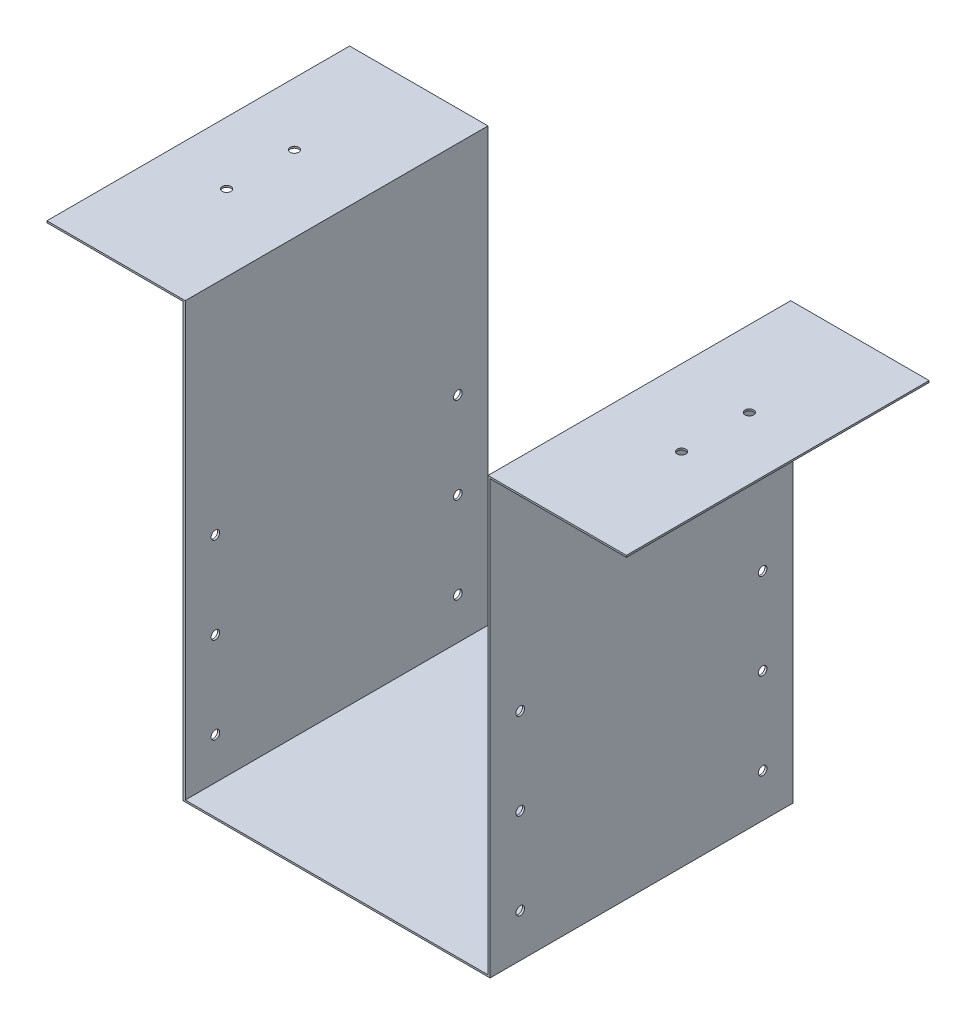
ISO-10303-21;
HEADER;
FILE_DESCRIPTION(('STEP AP214'),'2;1');
FILE_NAME('part.step','',(''),(''),'','','');
FILE_SCHEMA(('AUTOMOTIVE_DESIGN { 1 0 10303 214 1 1 1 1 }'));
ENDSEC;
DATA;
#1=APPLICATION_CONTEXT('core data for automotive mechanical design processes');
#2=APPLICATION_PROTOCOL_DEFINITION('international standard','automotive_design',2000,#1);
#3=PRODUCT_CONTEXT('',#1,'mechanical');
#4=PRODUCT('Part','Part','',(#3));
#5=PRODUCT_RELATED_PRODUCT_CATEGORY('part','',(#4));
#6=PRODUCT_DEFINITION_FORMATION('','',#4);
#7=PRODUCT_DEFINITION_CONTEXT('part definition',#1,'design');
#8=PRODUCT_DEFINITION('design','',#6,#7);
#9=PRODUCT_DEFINITION_SHAPE('','',#8);
#10=(LENGTH_UNIT() NAMED_UNIT(*) SI_UNIT(.MILLI.,.METRE.));
#11=(NAMED_UNIT(*) PLANE_ANGLE_UNIT() SI_UNIT($,.RADIAN.));
#12=(NAMED_UNIT(*) SI_UNIT($,.STERADIAN.) SOLID_ANGLE_UNIT());
#13=UNCERTAINTY_MEASURE_WITH_UNIT(LENGTH_MEASURE(1.E-05),#10,'distance_accuracy_value','');
#14=(GEOMETRIC_REPRESENTATION_CONTEXT(3) GLOBAL_UNCERTAINTY_ASSIGNED_CONTEXT((#13)) GLOBAL_UNIT_ASSIGNED_CONTEXT((#10,
#11,#12)) REPRESENTATION_CONTEXT('',''));
#15=CARTESIAN_POINT('',(0.,0.,0.));
#16=DIRECTION('',(0.,0.,1.));
#17=DIRECTION('',(1.,0.,0.));
#18=AXIS2_PLACEMENT_3D('',#15,#16,#17);
#19=CARTESIAN_POINT('',(-87.5,1.,-87.5));
#20=DIRECTION('',(0.,0.,1.));
#21=DIRECTION('',(1.,0.,0.));
#22=AXIS2_PLACEMENT_3D('',#19,#20,#21);
#23=PLANE('',#22);
#24=DIRECTION('',(-1.,0.,0.));
#25=VECTOR('',#24,1.);
#26=CARTESIAN_POINT('',(-87.5,0.,-87.5));
#27=LINE('',#26,#25);
#28=CARTESIAN_POINT('',(88.7,0.,-87.5));
#29=VERTEX_POINT('',#28);
#30=CARTESIAN_POINT('',(-88.7,0.,-87.5));
#31=VERTEX_POINT('',#30);
#32=EDGE_CURVE('E204',#29,#31,#27,.T.);
#33=ORIENTED_EDGE('',*,*,#32,.T.);
#34=DIRECTION('',(0.,-1.,0.));
#35=VECTOR('',#34,1.);
#36=CARTESIAN_POINT('',(-88.7,250.,-87.5));
#37=LINE('',#36,#35);
#38=CARTESIAN_POINT('',(-88.7,250.,-87.5));
#39=VERTEX_POINT('',#38);
#40=EDGE_CURVE('E205',#39,#31,#37,.T.);
#41=ORIENTED_EDGE('',*,*,#40,.F.);
#42=DIRECTION('',(-1.,0.,0.));
#43=VECTOR('',#42,1.);
#44=CARTESIAN_POINT('',(-87.5,250.,-87.5));
#45=LINE('',#44,#43);
#46=CARTESIAN_POINT('',(-167.5,250.,-87.5));
#47=VERTEX_POINT('',#46);
#48=EDGE_CURVE('E162',#39,#47,#45,.T.);
#49=ORIENTED_EDGE('',*,*,#48,.T.);
#50=DIRECTION('',(0.,-1.,0.));
#51=VECTOR('',#50,1.);
#52=CARTESIAN_POINT('',(-167.5,251.,-87.5));
#53=LINE('',#52,#51);
#54=CARTESIAN_POINT('',(-167.5,251.,-87.5));
#55=VERTEX_POINT('',#54);
#56=EDGE_CURVE('E181',#55,#47,#53,.T.);
#57=ORIENTED_EDGE('',*,*,#56,.F.);
#58=DIRECTION('',(-1.,0.,0.));
#59=VECTOR('',#58,1.);
#60=CARTESIAN_POINT('',(-87.5,251.,-87.5));
#61=LINE('',#60,#59);
#62=CARTESIAN_POINT('',(-87.5,251.,-87.5));
#63=VERTEX_POINT('',#62);
#64=EDGE_CURVE('E166',#63,#55,#61,.T.);
#65=ORIENTED_EDGE('',*,*,#64,.F.);
#66=DIRECTION('',(0.,-1.,0.));
#67=VECTOR('',#66,1.);
#68=CARTESIAN_POINT('',(-87.5,250.,-87.5));
#69=LINE('',#68,#67);
#70=CARTESIAN_POINT('',(-87.5,1.,-87.5));
#71=VERTEX_POINT('',#70);
#72=EDGE_CURVE('E202',#63,#71,#69,.T.);
#73=ORIENTED_EDGE('',*,*,#72,.T.);
#74=DIRECTION('',(-1.,0.,0.));
#75=VECTOR('',#74,1.);
#76=CARTESIAN_POINT('',(-87.5,1.,-87.5));
#77=LINE('',#76,#75);
#78=CARTESIAN_POINT('',(87.5,1.,-87.5));
#79=VERTEX_POINT('',#78);
#80=EDGE_CURVE('E126',#79,#71,#77,.T.);
#81=ORIENTED_EDGE('',*,*,#80,.F.);
#82=DIRECTION('',(0.,-1.,0.));
#83=VECTOR('',#82,1.);
#84=CARTESIAN_POINT('',(87.5,250.,-87.5));
#85=LINE('',#84,#83);
#86=CARTESIAN_POINT('',(87.5,251.,-87.5));
#87=VERTEX_POINT('',#86);
#88=EDGE_CURVE('E56',#87,#79,#85,.T.);
#89=ORIENTED_EDGE('',*,*,#88,.F.);
#90=DIRECTION('',(-1.,0.,0.));
#91=VECTOR('',#90,1.);
#92=CARTESIAN_POINT('',(87.5,251.,-87.5));
#93=LINE('',#92,#91);
#94=CARTESIAN_POINT('',(167.5,251.,-87.5));
#95=VERTEX_POINT('',#94);
#96=EDGE_CURVE('E123',#95,#87,#93,.T.);
#97=ORIENTED_EDGE('',*,*,#96,.F.);
#98=DIRECTION('',(0.,-1.,0.));
#99=VECTOR('',#98,1.);
#100=CARTESIAN_POINT('',(167.5,251.,-87.5));
#101=LINE('',#100,#99);
#102=CARTESIAN_POINT('',(167.5,250.,-87.5));
#103=VERTEX_POINT('',#102);
#104=EDGE_CURVE('E153',#95,#103,#101,.T.);
#105=ORIENTED_EDGE('',*,*,#104,.T.);
#106=DIRECTION('',(-1.,0.,0.));
#107=VECTOR('',#106,1.);
#108=CARTESIAN_POINT('',(87.5,250.,-87.5));
#109=LINE('',#108,#107);
#110=CARTESIAN_POINT('',(88.7,250.,-87.5));
#111=VERTEX_POINT('',#110);
#112=EDGE_CURVE('E154',#103,#111,#109,.T.);
#113=ORIENTED_EDGE('',*,*,#112,.T.);
#114=DIRECTION('',(0.,-1.,0.));
#115=VECTOR('',#114,1.);
#116=CARTESIAN_POINT('',(88.7,250.,-87.5));
#117=LINE('',#116,#115);
#118=EDGE_CURVE('E188',#111,#29,#117,.T.);
#119=ORIENTED_EDGE('',*,*,#118,.T.);
#120=EDGE_LOOP('',(#33,#41,#49,#57,#65,#73,#81,#89,#97,#105,#113,#119));
#121=FACE_BOUND('',#120,.T.);
#122=ADVANCED_FACE('F32',(#121),#23,.F.);
#123=CARTESIAN_POINT('',(-87.5,1.,87.5));
#124=DIRECTION('',(0.,0.,-1.));
#125=DIRECTION('',(-1.,0.,0.));
#126=AXIS2_PLACEMENT_3D('',#123,#124,#125);
#127=PLANE('',#126);
#128=DIRECTION('',(1.,0.,0.));
#129=VECTOR('',#128,1.);
#130=CARTESIAN_POINT('',(-87.5,0.,87.5));
#131=LINE('',#130,#129);
#132=CARTESIAN_POINT('',(-88.7,0.,87.5));
#133=VERTEX_POINT('',#132);
#134=CARTESIAN_POINT('',(88.7,0.,87.5));
#135=VERTEX_POINT('',#134);
#136=EDGE_CURVE('E214',#133,#135,#131,.T.);
#137=ORIENTED_EDGE('',*,*,#136,.T.);
#138=DIRECTION('',(0.,-1.,0.));
#139=VECTOR('',#138,1.);
#140=CARTESIAN_POINT('',(88.7,250.,87.5));
#141=LINE('',#140,#139);
#142=CARTESIAN_POINT('',(88.7,250.,87.5));
#143=VERTEX_POINT('',#142);
#144=EDGE_CURVE('E192',#143,#135,#141,.T.);
#145=ORIENTED_EDGE('',*,*,#144,.F.);
#146=DIRECTION('',(1.,0.,0.));
#147=VECTOR('',#146,1.);
#148=CARTESIAN_POINT('',(87.5,250.,87.5));
#149=LINE('',#148,#147);
#150=CARTESIAN_POINT('',(167.5,250.,87.5));
#151=VERTEX_POINT('',#150);
#152=EDGE_CURVE('E145',#143,#151,#149,.T.);
#153=ORIENTED_EDGE('',*,*,#152,.T.);
#154=DIRECTION('',(0.,-1.,0.));
#155=VECTOR('',#154,1.);
#156=CARTESIAN_POINT('',(167.5,251.,87.5));
#157=LINE('',#156,#155);
#158=CARTESIAN_POINT('',(167.5,251.,87.5));
#159=VERTEX_POINT('',#158);
#160=EDGE_CURVE('E159',#159,#151,#157,.T.);
#161=ORIENTED_EDGE('',*,*,#160,.F.);
#162=DIRECTION('',(1.,0.,0.));
#163=VECTOR('',#162,1.);
#164=CARTESIAN_POINT('',(87.5,251.,87.5));
#165=LINE('',#164,#163);
#166=CARTESIAN_POINT('',(87.5,251.,87.5));
#167=VERTEX_POINT('',#166);
#168=EDGE_CURVE('E137',#167,#159,#165,.T.);
#169=ORIENTED_EDGE('',*,*,#168,.F.);
#170=DIRECTION('',(0.,-1.,0.));
#171=VECTOR('',#170,1.);
#172=CARTESIAN_POINT('',(87.5,250.,87.5));
#173=LINE('',#172,#171);
#174=CARTESIAN_POINT('',(87.5,1.,87.5));
#175=VERTEX_POINT('',#174);
#176=EDGE_CURVE('E129',#167,#175,#173,.T.);
#177=ORIENTED_EDGE('',*,*,#176,.T.);
#178=DIRECTION('',(1.,0.,0.));
#179=VECTOR('',#178,1.);
#180=CARTESIAN_POINT('',(-87.5,1.,87.5));
#181=LINE('',#180,#179);
#182=CARTESIAN_POINT('',(-87.5,1.,87.5));
#183=VERTEX_POINT('',#182);
#184=EDGE_CURVE('E11',#183,#175,#181,.T.);
#185=ORIENTED_EDGE('',*,*,#184,.F.);
#186=DIRECTION('',(0.,-1.,0.));
#187=VECTOR('',#186,1.);
#188=CARTESIAN_POINT('',(-87.5,250.,87.5));
#189=LINE('',#188,#187);
#190=CARTESIAN_POINT('',(-87.5,251.,87.5));
#191=VERTEX_POINT('',#190);
#192=EDGE_CURVE('E48',#191,#183,#189,.T.);
#193=ORIENTED_EDGE('',*,*,#192,.F.);
#194=DIRECTION('',(1.,0.,0.));
#195=VECTOR('',#194,1.);
#196=CARTESIAN_POINT('',(-87.5,251.,87.5));
#197=LINE('',#196,#195);
#198=CARTESIAN_POINT('',(-167.5,251.,87.5));
#199=VERTEX_POINT('',#198);
#200=EDGE_CURVE('E171',#199,#191,#197,.T.);
#201=ORIENTED_EDGE('',*,*,#200,.F.);
#202=DIRECTION('',(0.,-1.,0.));
#203=VECTOR('',#202,1.);
#204=CARTESIAN_POINT('',(-167.5,251.,87.5));
#205=LINE('',#204,#203);
#206=CARTESIAN_POINT('',(-167.5,250.,87.5));
#207=VERTEX_POINT('',#206);
#208=EDGE_CURVE('E174',#199,#207,#205,.T.);
#209=ORIENTED_EDGE('',*,*,#208,.T.);
#210=DIRECTION('',(1.,0.,0.));
#211=VECTOR('',#210,1.);
#212=CARTESIAN_POINT('',(-87.5,250.,87.5));
#213=LINE('',#212,#211);
#214=CARTESIAN_POINT('',(-88.7,250.,87.5));
#215=VERTEX_POINT('',#214);
#216=EDGE_CURVE('E167',#207,#215,#213,.T.);
#217=ORIENTED_EDGE('',*,*,#216,.T.);
#218=DIRECTION('',(0.,-1.,0.));
#219=VECTOR('',#218,1.);
#220=CARTESIAN_POINT('',(-88.7,250.,87.5));
#221=LINE('',#220,#219);
#222=EDGE_CURVE('E208',#215,#133,#221,.T.);
#223=ORIENTED_EDGE('',*,*,#222,.T.);
#224=EDGE_LOOP('',(#137,#145,#153,#161,#169,#177,#185,#193,#201,#209,#217,#223));
#225=FACE_BOUND('',#224,.T.);
#226=ADVANCED_FACE('F251',(#225),#127,.F.);
#227=CARTESIAN_POINT('',(0.,1.,0.));
#228=DIRECTION('',(0.,-1.,0.));
#229=DIRECTION('',(0.,0.,-1.));
#230=AXIS2_PLACEMENT_3D('',#227,#228,#229);
#231=PLANE('',#230);
#232=DIRECTION('',(0.,0.,-1.));
#233=VECTOR('',#232,1.);
#234=CARTESIAN_POINT('',(87.5,1.,87.5));
#235=LINE('',#234,#233);
#236=EDGE_CURVE('E212',#175,#79,#235,.T.);
#237=ORIENTED_EDGE('',*,*,#236,.T.);
#238=ORIENTED_EDGE('',*,*,#80,.T.);
#239=DIRECTION('',(0.,0.,1.));
#240=VECTOR('',#239,1.);
#241=CARTESIAN_POINT('',(-87.5,1.,87.5));
#242=LINE('',#241,#240);
#243=EDGE_CURVE('E40',#71,#183,#242,.T.);
#244=ORIENTED_EDGE('',*,*,#243,.T.);
#245=ORIENTED_EDGE('',*,*,#184,.T.);
#246=EDGE_LOOP('',(#237,#238,#244,#245));
#247=FACE_BOUND('',#246,.T.);
#248=ADVANCED_FACE('F263',(#247),#231,.F.);
#249=CARTESIAN_POINT('',(0.,0.,0.));
#250=DIRECTION('',(0.,-1.,0.));
#251=DIRECTION('',(0.,0.,-1.));
#252=AXIS2_PLACEMENT_3D('',#249,#250,#251);
#253=PLANE('',#252);
#254=ORIENTED_EDGE('',*,*,#32,.F.);
#255=DIRECTION('',(0.,0.,1.));
#256=VECTOR('',#255,1.);
#257=CARTESIAN_POINT('',(88.7,0.,-87.5));
#258=LINE('',#257,#256);
#259=EDGE_CURVE('E184',#29,#135,#258,.T.);
#260=ORIENTED_EDGE('',*,*,#259,.T.);
#261=ORIENTED_EDGE('',*,*,#136,.F.);
#262=DIRECTION('',(0.,0.,-1.));
#263=VECTOR('',#262,1.);
#264=CARTESIAN_POINT('',(-88.7,0.,-87.5));
#265=LINE('',#264,#263);
#266=EDGE_CURVE('E128',#133,#31,#265,.T.);
#267=ORIENTED_EDGE('',*,*,#266,.T.);
#268=EDGE_LOOP('',(#254,#260,#261,#267));
#269=FACE_BOUND('',#268,.T.);
#270=ADVANCED_FACE('F275',(#269),#253,.T.);
#271=CARTESIAN_POINT('',(-87.5,250.,-87.5));
#272=DIRECTION('',(1.,0.,0.));
#273=DIRECTION('',(0.,0.,-1.));
#274=AXIS2_PLACEMENT_3D('',#271,#272,#273);
#275=PLANE('',#274);
#276=CARTESIAN_POINT('',(-87.5,25.,70.0773363331706));
#277=DIRECTION('',(1.,0.,0.));
#278=DIRECTION('',(0.,0.,-1.));
#279=AXIS2_PLACEMENT_3D('',#276,#277,#278);
#280=CIRCLE('',#279,2.5);
#281=CARTESIAN_POINT('',(-87.5,25.,67.5773363331706));
#282=VERTEX_POINT('',#281);
#283=EDGE_CURVE('E615',#282,#282,#280,.T.);
#284=ORIENTED_EDGE('',*,*,#283,.F.);
#285=EDGE_LOOP('',(#284));
#286=FACE_BOUND('',#285,.T.);
#287=CARTESIAN_POINT('',(-87.5,75.,70.0773363331706));
#288=DIRECTION('',(1.,0.,0.));
#289=DIRECTION('',(0.,0.,-1.));
#290=AXIS2_PLACEMENT_3D('',#287,#288,#289);
#291=CIRCLE('',#290,2.5);
#292=CARTESIAN_POINT('',(-87.5,75.,67.5773363331706));
#293=VERTEX_POINT('',#292);
#294=EDGE_CURVE('E608',#293,#293,#291,.T.);
#295=ORIENTED_EDGE('',*,*,#294,.F.);
#296=EDGE_LOOP('',(#295));
#297=FACE_BOUND('',#296,.T.);
#298=CARTESIAN_POINT('',(-87.5,125.,70.0773363331706));
#299=DIRECTION('',(1.,0.,0.));
#300=DIRECTION('',(0.,0.,-1.));
#301=AXIS2_PLACEMENT_3D('',#298,#299,#300);
#302=CIRCLE('',#301,2.5);
#303=CARTESIAN_POINT('',(-87.5,125.,67.5773363331706));
#304=VERTEX_POINT('',#303);
#305=EDGE_CURVE('E601',#304,#304,#302,.T.);
#306=ORIENTED_EDGE('',*,*,#305,.F.);
#307=EDGE_LOOP('',(#306));
#308=FACE_BOUND('',#307,.T.);
#309=CARTESIAN_POINT('',(-87.5,125.,-70.0773363331706));
#310=DIRECTION('',(1.,0.,0.));
#311=DIRECTION('',(0.,0.,-1.));
#312=AXIS2_PLACEMENT_3D('',#309,#310,#311);
#313=CIRCLE('',#312,2.5);
#314=CARTESIAN_POINT('',(-87.5,125.,-72.5773363331706));
#315=VERTEX_POINT('',#314);
#316=EDGE_CURVE('E594',#315,#315,#313,.T.);
#317=ORIENTED_EDGE('',*,*,#316,.F.);
#318=EDGE_LOOP('',(#317));
#319=FACE_BOUND('',#318,.T.);
#320=CARTESIAN_POINT('',(-87.5,75.,-70.0773363331706));
#321=DIRECTION('',(1.,0.,0.));
#322=DIRECTION('',(0.,0.,-1.));
#323=AXIS2_PLACEMENT_3D('',#320,#321,#322);
#324=CIRCLE('',#323,2.5);
#325=CARTESIAN_POINT('',(-87.5,75.,-72.5773363331706));
#326=VERTEX_POINT('',#325);
#327=EDGE_CURVE('E587',#326,#326,#324,.T.);
#328=ORIENTED_EDGE('',*,*,#327,.F.);
#329=EDGE_LOOP('',(#328));
#330=FACE_BOUND('',#329,.T.);
#331=CARTESIAN_POINT('',(-87.5,25.,-70.0773363331706));
#332=DIRECTION('',(1.,0.,0.));
#333=DIRECTION('',(0.,0.,-1.));
#334=AXIS2_PLACEMENT_3D('',#331,#332,#333);
#335=CIRCLE('',#334,2.5);
#336=CARTESIAN_POINT('',(-87.5,25.,-72.5773363331706));
#337=VERTEX_POINT('',#336);
#338=EDGE_CURVE('E573',#337,#337,#335,.T.);
#339=ORIENTED_EDGE('',*,*,#338,.F.);
#340=EDGE_LOOP('',(#339));
#341=FACE_BOUND('',#340,.T.);
#342=ORIENTED_EDGE('',*,*,#243,.F.);
#343=ORIENTED_EDGE('',*,*,#72,.F.);
#344=DIRECTION('',(0.,0.,-1.));
#345=VECTOR('',#344,1.);
#346=CARTESIAN_POINT('',(-87.5,251.,-87.5));
#347=LINE('',#346,#345);
#348=EDGE_CURVE('E163',#191,#63,#347,.T.);
#349=ORIENTED_EDGE('',*,*,#348,.F.);
#350=ORIENTED_EDGE('',*,*,#192,.T.);
#351=EDGE_LOOP('',(#342,#343,#349,#350));
#352=FACE_BOUND('',#351,.T.);
#353=ADVANCED_FACE('F260',(#286,#297,#308,#319,#330,#341,#352),#275,.T.);
#354=CARTESIAN_POINT('',(-88.7,250.,-87.5));
#355=DIRECTION('',(-1.,0.,0.));
#356=DIRECTION('',(0.,0.,1.));
#357=AXIS2_PLACEMENT_3D('',#354,#355,#356);
#358=PLANE('',#357);
#359=CARTESIAN_POINT('',(-88.7,25.,70.0773363331706));
#360=DIRECTION('',(-1.,0.,0.));
#361=DIRECTION('',(0.,0.,1.));
#362=AXIS2_PLACEMENT_3D('',#359,#360,#361);
#363=CIRCLE('',#362,2.5);
#364=CARTESIAN_POINT('',(-88.7,25.,72.5773363331706));
#365=VERTEX_POINT('',#364);
#366=EDGE_CURVE('E552',#365,#365,#363,.T.);
#367=ORIENTED_EDGE('',*,*,#366,.F.);
#368=EDGE_LOOP('',(#367));
#369=FACE_BOUND('',#368,.T.);
#370=CARTESIAN_POINT('',(-88.7,75.,70.0773363331706));
#371=DIRECTION('',(-1.,0.,0.));
#372=DIRECTION('',(0.,0.,1.));
#373=AXIS2_PLACEMENT_3D('',#370,#371,#372);
#374=CIRCLE('',#373,2.5);
#375=CARTESIAN_POINT('',(-88.7,75.,72.5773363331706));
#376=VERTEX_POINT('',#375);
#377=EDGE_CURVE('E556',#376,#376,#374,.T.);
#378=ORIENTED_EDGE('',*,*,#377,.F.);
#379=EDGE_LOOP('',(#378));
#380=FACE_BOUND('',#379,.T.);
#381=CARTESIAN_POINT('',(-88.7,125.,70.0773363331706));
#382=DIRECTION('',(-1.,0.,0.));
#383=DIRECTION('',(0.,0.,1.));
#384=AXIS2_PLACEMENT_3D('',#381,#382,#383);
#385=CIRCLE('',#384,2.5);
#386=CARTESIAN_POINT('',(-88.7,125.,72.5773363331706));
#387=VERTEX_POINT('',#386);
#388=EDGE_CURVE('E560',#387,#387,#385,.T.);
#389=ORIENTED_EDGE('',*,*,#388,.F.);
#390=EDGE_LOOP('',(#389));
#391=FACE_BOUND('',#390,.T.);
#392=CARTESIAN_POINT('',(-88.7,125.,-70.0773363331706));
#393=DIRECTION('',(-1.,0.,0.));
#394=DIRECTION('',(0.,0.,1.));
#395=AXIS2_PLACEMENT_3D('',#392,#393,#394);
#396=CIRCLE('',#395,2.5);
#397=CARTESIAN_POINT('',(-88.7,125.,-67.5773363331706));
#398=VERTEX_POINT('',#397);
#399=EDGE_CURVE('E564',#398,#398,#396,.T.);
#400=ORIENTED_EDGE('',*,*,#399,.F.);
#401=EDGE_LOOP('',(#400));
#402=FACE_BOUND('',#401,.T.);
#403=CARTESIAN_POINT('',(-88.7,75.,-70.0773363331706));
#404=DIRECTION('',(-1.,0.,0.));
#405=DIRECTION('',(0.,0.,1.));
#406=AXIS2_PLACEMENT_3D('',#403,#404,#405);
#407=CIRCLE('',#406,2.5);
#408=CARTESIAN_POINT('',(-88.7,75.,-67.5773363331706));
#409=VERTEX_POINT('',#408);
#410=EDGE_CURVE('E568',#409,#409,#407,.T.);
#411=ORIENTED_EDGE('',*,*,#410,.F.);
#412=EDGE_LOOP('',(#411));
#413=FACE_BOUND('',#412,.T.);
#414=CARTESIAN_POINT('',(-88.7,25.,-70.0773363331706));
#415=DIRECTION('',(-1.,0.,0.));
#416=DIRECTION('',(0.,0.,1.));
#417=AXIS2_PLACEMENT_3D('',#414,#415,#416);
#418=CIRCLE('',#417,2.5);
#419=CARTESIAN_POINT('',(-88.7,25.,-67.5773363331706));
#420=VERTEX_POINT('',#419);
#421=EDGE_CURVE('E571',#420,#420,#418,.T.);
#422=ORIENTED_EDGE('',*,*,#421,.F.);
#423=EDGE_LOOP('',(#422));
#424=FACE_BOUND('',#423,.T.);
#425=ORIENTED_EDGE('',*,*,#266,.F.);
#426=ORIENTED_EDGE('',*,*,#222,.F.);
#427=DIRECTION('',(0.,0.,-1.));
#428=VECTOR('',#427,1.);
#429=CARTESIAN_POINT('',(-88.7,250.,-87.5));
#430=LINE('',#429,#428);
#431=EDGE_CURVE('E197',#215,#39,#430,.T.);
#432=ORIENTED_EDGE('',*,*,#431,.T.);
#433=ORIENTED_EDGE('',*,*,#40,.T.);
#434=EDGE_LOOP('',(#425,#426,#432,#433));
#435=FACE_BOUND('',#434,.T.);
#436=ADVANCED_FACE('F249',(#369,#380,#391,#402,#413,#424,#435),#358,.T.);
#437=CARTESIAN_POINT('',(87.5,250.,-87.5));
#438=DIRECTION('',(-1.,0.,0.));
#439=DIRECTION('',(0.,0.,1.));
#440=AXIS2_PLACEMENT_3D('',#437,#438,#439);
#441=PLANE('',#440);
#442=CARTESIAN_POINT('',(87.5,25.,70.0773363331706));
#443=DIRECTION('',(-1.,0.,0.));
#444=DIRECTION('',(0.,0.,1.));
#445=AXIS2_PLACEMENT_3D('',#442,#443,#444);
#446=CIRCLE('',#445,2.5);
#447=CARTESIAN_POINT('',(87.5,25.,72.5773363331706));
#448=VERTEX_POINT('',#447);
#449=EDGE_CURVE('E611',#448,#448,#446,.T.);
#450=ORIENTED_EDGE('',*,*,#449,.F.);
#451=EDGE_LOOP('',(#450));
#452=FACE_BOUND('',#451,.T.);
#453=CARTESIAN_POINT('',(87.5,75.,70.0773363331706));
#454=DIRECTION('',(-1.,0.,0.));
#455=DIRECTION('',(0.,0.,1.));
#456=AXIS2_PLACEMENT_3D('',#453,#454,#455);
#457=CIRCLE('',#456,2.5);
#458=CARTESIAN_POINT('',(87.5,75.,72.5773363331706));
#459=VERTEX_POINT('',#458);
#460=EDGE_CURVE('E604',#459,#459,#457,.T.);
#461=ORIENTED_EDGE('',*,*,#460,.F.);
#462=EDGE_LOOP('',(#461));
#463=FACE_BOUND('',#462,.T.);
#464=CARTESIAN_POINT('',(87.5,125.,70.0773363331706));
#465=DIRECTION('',(-1.,0.,0.));
#466=DIRECTION('',(0.,0.,1.));
#467=AXIS2_PLACEMENT_3D('',#464,#465,#466);
#468=CIRCLE('',#467,2.5);
#469=CARTESIAN_POINT('',(87.5,125.,72.5773363331706));
#470=VERTEX_POINT('',#469);
#471=EDGE_CURVE('E597',#470,#470,#468,.T.);
#472=ORIENTED_EDGE('',*,*,#471,.F.);
#473=EDGE_LOOP('',(#472));
#474=FACE_BOUND('',#473,.T.);
#475=CARTESIAN_POINT('',(87.5,125.,-70.0773363331706));
#476=DIRECTION('',(-1.,0.,0.));
#477=DIRECTION('',(0.,0.,1.));
#478=AXIS2_PLACEMENT_3D('',#475,#476,#477);
#479=CIRCLE('',#478,2.5);
#480=CARTESIAN_POINT('',(87.5,125.,-67.5773363331706));
#481=VERTEX_POINT('',#480);
#482=EDGE_CURVE('E590',#481,#481,#479,.T.);
#483=ORIENTED_EDGE('',*,*,#482,.F.);
#484=EDGE_LOOP('',(#483));
#485=FACE_BOUND('',#484,.T.);
#486=CARTESIAN_POINT('',(87.5,75.,-70.0773363331706));
#487=DIRECTION('',(-1.,0.,0.));
#488=DIRECTION('',(0.,0.,1.));
#489=AXIS2_PLACEMENT_3D('',#486,#487,#488);
#490=CIRCLE('',#489,2.5);
#491=CARTESIAN_POINT('',(87.5,75.,-67.5773363331706));
#492=VERTEX_POINT('',#491);
#493=EDGE_CURVE('E577',#492,#492,#490,.T.);
#494=ORIENTED_EDGE('',*,*,#493,.F.);
#495=EDGE_LOOP('',(#494));
#496=FACE_BOUND('',#495,.T.);
#497=CARTESIAN_POINT('',(87.5,25.,-70.0773363331706));
#498=DIRECTION('',(-1.,0.,0.));
#499=DIRECTION('',(0.,0.,1.));
#500=AXIS2_PLACEMENT_3D('',#497,#498,#499);
#501=CIRCLE('',#500,2.5);
#502=CARTESIAN_POINT('',(87.5,25.,-67.5773363331706));
#503=VERTEX_POINT('',#502);
#504=EDGE_CURVE('E574',#503,#503,#501,.T.);
#505=ORIENTED_EDGE('',*,*,#504,.F.);
#506=EDGE_LOOP('',(#505));
#507=FACE_BOUND('',#506,.T.);
#508=ORIENTED_EDGE('',*,*,#236,.F.);
#509=ORIENTED_EDGE('',*,*,#176,.F.);
#510=DIRECTION('',(0.,0.,1.));
#511=VECTOR('',#510,1.);
#512=CARTESIAN_POINT('',(87.5,251.,-87.5));
#513=LINE('',#512,#511);
#514=EDGE_CURVE('E132',#87,#167,#513,.T.);
#515=ORIENTED_EDGE('',*,*,#514,.F.);
#516=ORIENTED_EDGE('',*,*,#88,.T.);
#517=EDGE_LOOP('',(#508,#509,#515,#516));
#518=FACE_BOUND('',#517,.T.);
#519=ADVANCED_FACE('F133',(#452,#463,#474,#485,#496,#507,#518),#441,.T.);
#520=CARTESIAN_POINT('',(88.7,250.,-87.5));
#521=DIRECTION('',(1.,0.,0.));
#522=DIRECTION('',(0.,0.,-1.));
#523=AXIS2_PLACEMENT_3D('',#520,#521,#522);
#524=PLANE('',#523);
#525=CARTESIAN_POINT('',(88.7,25.,70.0773363331706));
#526=DIRECTION('',(1.,0.,0.));
#527=DIRECTION('',(0.,0.,1.));
#528=AXIS2_PLACEMENT_3D('',#525,#526,#527);
#529=CIRCLE('',#528,2.5);
#530=CARTESIAN_POINT('',(88.7,25.,72.5773363331706));
#531=VERTEX_POINT('',#530);
#532=EDGE_CURVE('E670',#531,#531,#529,.T.);
#533=ORIENTED_EDGE('',*,*,#532,.F.);
#534=EDGE_LOOP('',(#533));
#535=FACE_BOUND('',#534,.T.);
#536=CARTESIAN_POINT('',(88.7,75.,70.0773363331706));
#537=DIRECTION('',(1.,0.,0.));
#538=DIRECTION('',(0.,0.,1.));
#539=AXIS2_PLACEMENT_3D('',#536,#537,#538);
#540=CIRCLE('',#539,2.5);
#541=CARTESIAN_POINT('',(88.7,75.,72.5773363331706));
#542=VERTEX_POINT('',#541);
#543=EDGE_CURVE('E673',#542,#542,#540,.T.);
#544=ORIENTED_EDGE('',*,*,#543,.F.);
#545=EDGE_LOOP('',(#544));
#546=FACE_BOUND('',#545,.T.);
#547=CARTESIAN_POINT('',(88.7,125.,70.0773363331706));
#548=DIRECTION('',(1.,0.,0.));
#549=DIRECTION('',(0.,0.,1.));
#550=AXIS2_PLACEMENT_3D('',#547,#548,#549);
#551=CIRCLE('',#550,2.5);
#552=CARTESIAN_POINT('',(88.7,125.,72.5773363331706));
#553=VERTEX_POINT('',#552);
#554=EDGE_CURVE('E676',#553,#553,#551,.T.);
#555=ORIENTED_EDGE('',*,*,#554,.F.);
#556=EDGE_LOOP('',(#555));
#557=FACE_BOUND('',#556,.T.);
#558=CARTESIAN_POINT('',(88.7,125.,-70.0773363331706));
#559=DIRECTION('',(1.,0.,0.));
#560=DIRECTION('',(0.,0.,-1.));
#561=AXIS2_PLACEMENT_3D('',#558,#559,#560);
#562=CIRCLE('',#561,2.5);
#563=CARTESIAN_POINT('',(88.7,125.,-72.5773363331706));
#564=VERTEX_POINT('',#563);
#565=EDGE_CURVE('E667',#564,#564,#562,.T.);
#566=ORIENTED_EDGE('',*,*,#565,.F.);
#567=EDGE_LOOP('',(#566));
#568=FACE_BOUND('',#567,.T.);
#569=CARTESIAN_POINT('',(88.7,75.,-70.0773363331706));
#570=DIRECTION('',(1.,0.,0.));
#571=DIRECTION('',(0.,0.,-1.));
#572=AXIS2_PLACEMENT_3D('',#569,#570,#571);
#573=CIRCLE('',#572,2.5);
#574=CARTESIAN_POINT('',(88.7,75.,-72.5773363331706));
#575=VERTEX_POINT('',#574);
#576=EDGE_CURVE('E665',#575,#575,#573,.T.);
#577=ORIENTED_EDGE('',*,*,#576,.F.);
#578=EDGE_LOOP('',(#577));
#579=FACE_BOUND('',#578,.T.);
#580=CARTESIAN_POINT('',(88.7,25.,-70.0773363331706));
#581=DIRECTION('',(1.,0.,0.));
#582=DIRECTION('',(0.,0.,-1.));
#583=AXIS2_PLACEMENT_3D('',#580,#581,#582);
#584=CIRCLE('',#583,2.5);
#585=CARTESIAN_POINT('',(88.7,25.,-72.5773363331706));
#586=VERTEX_POINT('',#585);
#587=EDGE_CURVE('E580',#586,#586,#584,.T.);
#588=ORIENTED_EDGE('',*,*,#587,.F.);
#589=EDGE_LOOP('',(#588));
#590=FACE_BOUND('',#589,.T.);
#591=ORIENTED_EDGE('',*,*,#259,.F.);
#592=ORIENTED_EDGE('',*,*,#118,.F.);
#593=DIRECTION('',(0.,0.,1.));
#594=VECTOR('',#593,1.);
#595=CARTESIAN_POINT('',(88.7,250.,-87.5));
#596=LINE('',#595,#594);
#597=EDGE_CURVE('E185',#111,#143,#596,.T.);
#598=ORIENTED_EDGE('',*,*,#597,.T.);
#599=ORIENTED_EDGE('',*,*,#144,.T.);
#600=EDGE_LOOP('',(#591,#592,#598,#599));
#601=FACE_BOUND('',#600,.T.);
#602=ADVANCED_FACE('F273',(#535,#546,#557,#568,#579,#590,#601),#524,.T.);
#603=CARTESIAN_POINT('',(-167.5,251.,-87.5));
#604=DIRECTION('',(1.,0.,0.));
#605=DIRECTION('',(0.,0.,-1.));
#606=AXIS2_PLACEMENT_3D('',#603,#604,#605);
#607=PLANE('',#606);
#608=DIRECTION('',(0.,0.,1.));
#609=VECTOR('',#608,1.);
#610=CARTESIAN_POINT('',(-167.5,250.,-87.5));
#611=LINE('',#610,#609);
#612=EDGE_CURVE('E176',#47,#207,#611,.T.);
#613=ORIENTED_EDGE('',*,*,#612,.T.);
#614=ORIENTED_EDGE('',*,*,#208,.F.);
#615=DIRECTION('',(0.,0.,1.));
#616=VECTOR('',#615,1.);
#617=CARTESIAN_POINT('',(-167.5,251.,-87.5));
#618=LINE('',#617,#616);
#619=EDGE_CURVE('E169',#55,#199,#618,.T.);
#620=ORIENTED_EDGE('',*,*,#619,.F.);
#621=ORIENTED_EDGE('',*,*,#56,.T.);
#622=EDGE_LOOP('',(#613,#614,#620,#621));
#623=FACE_BOUND('',#622,.T.);
#624=ADVANCED_FACE('F257',(#623),#607,.F.);
#625=CARTESIAN_POINT('',(0.,251.,0.));
#626=DIRECTION('',(0.,-1.,0.));
#627=DIRECTION('',(0.,0.,-1.));
#628=AXIS2_PLACEMENT_3D('',#625,#626,#627);
#629=PLANE('',#628);
#630=CARTESIAN_POINT('',(-131.5,251.,-19.6));
#631=DIRECTION('',(0.,1.,0.));
#632=DIRECTION('',(0.,0.,-1.));
#633=AXIS2_PLACEMENT_3D('',#630,#631,#632);
#634=CIRCLE('',#633,2.50000000000005);
#635=CARTESIAN_POINT('',(-131.5,251.,-22.1000000000001));
#636=VERTEX_POINT('',#635);
#637=EDGE_CURVE('E617',#636,#636,#634,.T.);
#638=ORIENTED_EDGE('',*,*,#637,.F.);
#639=EDGE_LOOP('',(#638));
#640=FACE_BOUND('',#639,.T.);
#641=CARTESIAN_POINT('',(-131.5,251.,19.6));
#642=DIRECTION('',(0.,1.,0.));
#643=DIRECTION('',(0.,0.,1.));
#644=AXIS2_PLACEMENT_3D('',#641,#642,#643);
#645=CIRCLE('',#644,2.50000000000005);
#646=CARTESIAN_POINT('',(-131.5,251.,22.1000000000001));
#647=VERTEX_POINT('',#646);
#648=EDGE_CURVE('E621',#647,#647,#645,.T.);
#649=ORIENTED_EDGE('',*,*,#648,.F.);
#650=EDGE_LOOP('',(#649));
#651=FACE_BOUND('',#650,.T.);
#652=ORIENTED_EDGE('',*,*,#348,.T.);
#653=ORIENTED_EDGE('',*,*,#64,.T.);
#654=ORIENTED_EDGE('',*,*,#619,.T.);
#655=ORIENTED_EDGE('',*,*,#200,.T.);
#656=EDGE_LOOP('',(#652,#653,#654,#655));
#657=FACE_BOUND('',#656,.T.);
#658=ADVANCED_FACE('F238',(#640,#651,#657),#629,.F.);
#659=CARTESIAN_POINT('',(0.,250.,0.));
#660=DIRECTION('',(0.,-1.,0.));
#661=DIRECTION('',(0.,0.,-1.));
#662=AXIS2_PLACEMENT_3D('',#659,#660,#661);
#663=PLANE('',#662);
#664=CARTESIAN_POINT('',(-131.5,250.,-19.6));
#665=DIRECTION('',(0.,-1.,0.));
#666=DIRECTION('',(0.,0.,-1.));
#667=AXIS2_PLACEMENT_3D('',#664,#665,#666);
#668=CIRCLE('',#667,2.50000000000005);
#669=CARTESIAN_POINT('',(-131.5,250.,-22.1000000000001));
#670=VERTEX_POINT('',#669);
#671=EDGE_CURVE('E35',#670,#670,#668,.T.);
#672=ORIENTED_EDGE('',*,*,#671,.F.);
#673=EDGE_LOOP('',(#672));
#674=FACE_BOUND('',#673,.T.);
#675=CARTESIAN_POINT('',(-131.5,250.,19.6));
#676=DIRECTION('',(0.,-1.,0.));
#677=DIRECTION('',(0.,0.,-1.));
#678=AXIS2_PLACEMENT_3D('',#675,#676,#677);
#679=CIRCLE('',#678,2.50000000000005);
#680=CARTESIAN_POINT('',(-131.5,250.,17.1));
#681=VERTEX_POINT('',#680);
#682=EDGE_CURVE('E224',#681,#681,#679,.T.);
#683=ORIENTED_EDGE('',*,*,#682,.F.);
#684=EDGE_LOOP('',(#683));
#685=FACE_BOUND('',#684,.T.);
#686=ORIENTED_EDGE('',*,*,#48,.F.);
#687=ORIENTED_EDGE('',*,*,#431,.F.);
#688=ORIENTED_EDGE('',*,*,#216,.F.);
#689=ORIENTED_EDGE('',*,*,#612,.F.);
#690=EDGE_LOOP('',(#686,#687,#688,#689));
#691=FACE_BOUND('',#690,.T.);
#692=ADVANCED_FACE('F234',(#674,#685,#691),#663,.T.);
#693=CARTESIAN_POINT('',(167.5,251.,-87.5));
#694=DIRECTION('',(-1.,0.,0.));
#695=DIRECTION('',(0.,0.,1.));
#696=AXIS2_PLACEMENT_3D('',#693,#694,#695);
#697=PLANE('',#696);
#698=DIRECTION('',(0.,0.,-1.));
#699=VECTOR('',#698,1.);
#700=CARTESIAN_POINT('',(167.5,250.,-87.5));
#701=LINE('',#700,#699);
#702=EDGE_CURVE('E143',#151,#103,#701,.T.);
#703=ORIENTED_EDGE('',*,*,#702,.T.);
#704=ORIENTED_EDGE('',*,*,#104,.F.);
#705=DIRECTION('',(0.,0.,-1.));
#706=VECTOR('',#705,1.);
#707=CARTESIAN_POINT('',(167.5,251.,-87.5));
#708=LINE('',#707,#706);
#709=EDGE_CURVE('E141',#159,#95,#708,.T.);
#710=ORIENTED_EDGE('',*,*,#709,.F.);
#711=ORIENTED_EDGE('',*,*,#160,.T.);
#712=EDGE_LOOP('',(#703,#704,#710,#711));
#713=FACE_BOUND('',#712,.T.);
#714=ADVANCED_FACE('F237',(#713),#697,.F.);
#715=CARTESIAN_POINT('',(0.,251.,0.));
#716=DIRECTION('',(0.,-1.,0.));
#717=DIRECTION('',(0.,0.,-1.));
#718=AXIS2_PLACEMENT_3D('',#715,#716,#717);
#719=PLANE('',#718);
#720=CARTESIAN_POINT('',(131.5,251.,19.6));
#721=DIRECTION('',(0.,1.,0.));
#722=DIRECTION('',(0.,0.,-1.));
#723=AXIS2_PLACEMENT_3D('',#720,#721,#722);
#724=CIRCLE('',#723,2.5);
#725=CARTESIAN_POINT('',(131.5,251.,17.1));
#726=VERTEX_POINT('',#725);
#727=EDGE_CURVE('E618',#726,#726,#724,.T.);
#728=ORIENTED_EDGE('',*,*,#727,.F.);
#729=EDGE_LOOP('',(#728));
#730=FACE_BOUND('',#729,.T.);
#731=CARTESIAN_POINT('',(131.5,251.,-19.6));
#732=DIRECTION('',(0.,1.,0.));
#733=DIRECTION('',(0.,0.,1.));
#734=AXIS2_PLACEMENT_3D('',#731,#732,#733);
#735=CIRCLE('',#734,2.5);
#736=CARTESIAN_POINT('',(131.5,251.,-17.1));
#737=VERTEX_POINT('',#736);
#738=EDGE_CURVE('E148',#737,#737,#735,.T.);
#739=ORIENTED_EDGE('',*,*,#738,.F.);
#740=EDGE_LOOP('',(#739));
#741=FACE_BOUND('',#740,.T.);
#742=ORIENTED_EDGE('',*,*,#96,.T.);
#743=ORIENTED_EDGE('',*,*,#514,.T.);
#744=ORIENTED_EDGE('',*,*,#168,.T.);
#745=ORIENTED_EDGE('',*,*,#709,.T.);
#746=EDGE_LOOP('',(#742,#743,#744,#745));
#747=FACE_BOUND('',#746,.T.);
#748=ADVANCED_FACE('F139',(#730,#741,#747),#719,.F.);
#749=CARTESIAN_POINT('',(0.,250.,0.));
#750=DIRECTION('',(0.,-1.,0.));
#751=DIRECTION('',(0.,0.,-1.));
#752=AXIS2_PLACEMENT_3D('',#749,#750,#751);
#753=PLANE('',#752);
#754=CARTESIAN_POINT('',(131.5,250.,19.6));
#755=DIRECTION('',(0.,-1.,0.));
#756=DIRECTION('',(0.,0.,-1.));
#757=AXIS2_PLACEMENT_3D('',#754,#755,#756);
#758=CIRCLE('',#757,2.5);
#759=CARTESIAN_POINT('',(131.5,250.,17.1));
#760=VERTEX_POINT('',#759);
#761=EDGE_CURVE('E222',#760,#760,#758,.T.);
#762=ORIENTED_EDGE('',*,*,#761,.F.);
#763=EDGE_LOOP('',(#762));
#764=FACE_BOUND('',#763,.T.);
#765=CARTESIAN_POINT('',(131.5,250.,-19.6));
#766=DIRECTION('',(0.,-1.,0.));
#767=DIRECTION('',(0.,0.,-1.));
#768=AXIS2_PLACEMENT_3D('',#765,#766,#767);
#769=CIRCLE('',#768,2.5);
#770=CARTESIAN_POINT('',(131.5,250.,-22.1));
#771=VERTEX_POINT('',#770);
#772=EDGE_CURVE('E219',#771,#771,#769,.T.);
#773=ORIENTED_EDGE('',*,*,#772,.F.);
#774=EDGE_LOOP('',(#773));
#775=FACE_BOUND('',#774,.T.);
#776=ORIENTED_EDGE('',*,*,#152,.F.);
#777=ORIENTED_EDGE('',*,*,#597,.F.);
#778=ORIENTED_EDGE('',*,*,#112,.F.);
#779=ORIENTED_EDGE('',*,*,#702,.F.);
#780=EDGE_LOOP('',(#776,#777,#778,#779));
#781=FACE_BOUND('',#780,.T.);
#782=ADVANCED_FACE('F270',(#764,#775,#781),#753,.T.);
#783=CARTESIAN_POINT('',(131.5,241.,-19.6));
#784=DIRECTION('',(0.,1.,0.));
#785=DIRECTION('',(0.,0.,1.));
#786=AXIS2_PLACEMENT_3D('',#783,#784,#785);
#787=CYLINDRICAL_SURFACE('',#786,2.5);
#788=ORIENTED_EDGE('',*,*,#772,.T.);
#789=EDGE_LOOP('',(#788));
#790=FACE_BOUND('',#789,.T.);
#791=ORIENTED_EDGE('',*,*,#738,.T.);
#792=EDGE_LOOP('',(#791));
#793=FACE_BOUND('',#792,.T.);
#794=ADVANCED_FACE('F387',(#790,#793),#787,.F.);
#795=CARTESIAN_POINT('',(131.5,241.,19.6));
#796=DIRECTION('',(0.,1.,0.));
#797=DIRECTION('',(0.,0.,1.));
#798=AXIS2_PLACEMENT_3D('',#795,#796,#797);
#799=CYLINDRICAL_SURFACE('',#798,2.5);
#800=ORIENTED_EDGE('',*,*,#761,.T.);
#801=EDGE_LOOP('',(#800));
#802=FACE_BOUND('',#801,.T.);
#803=ORIENTED_EDGE('',*,*,#727,.T.);
#804=EDGE_LOOP('',(#803));
#805=FACE_BOUND('',#804,.T.);
#806=ADVANCED_FACE('F396',(#802,#805),#799,.F.);
#807=CARTESIAN_POINT('',(-131.5,241.,19.6));
#808=DIRECTION('',(0.,1.,0.));
#809=DIRECTION('',(0.,0.,1.));
#810=AXIS2_PLACEMENT_3D('',#807,#808,#809);
#811=CYLINDRICAL_SURFACE('',#810,2.50000000000005);
#812=ORIENTED_EDGE('',*,*,#682,.T.);
#813=EDGE_LOOP('',(#812));
#814=FACE_BOUND('',#813,.T.);
#815=ORIENTED_EDGE('',*,*,#648,.T.);
#816=EDGE_LOOP('',(#815));
#817=FACE_BOUND('',#816,.T.);
#818=ADVANCED_FACE('F405',(#814,#817),#811,.F.);
#819=CARTESIAN_POINT('',(-131.5,241.,-19.6));
#820=DIRECTION('',(0.,1.,0.));
#821=DIRECTION('',(0.,0.,1.));
#822=AXIS2_PLACEMENT_3D('',#819,#820,#821);
#823=CYLINDRICAL_SURFACE('',#822,2.50000000000005);
#824=ORIENTED_EDGE('',*,*,#671,.T.);
#825=EDGE_LOOP('',(#824));
#826=FACE_BOUND('',#825,.T.);
#827=ORIENTED_EDGE('',*,*,#637,.T.);
#828=EDGE_LOOP('',(#827));
#829=FACE_BOUND('',#828,.T.);
#830=ADVANCED_FACE('F231',(#826,#829),#823,.F.);
#831=CARTESIAN_POINT('',(-211.3,25.,-70.0773363331706));
#832=DIRECTION('',(1.,0.,0.));
#833=DIRECTION('',(0.,0.,-1.));
#834=AXIS2_PLACEMENT_3D('',#831,#832,#833);
#835=CYLINDRICAL_SURFACE('',#834,2.5);
#836=ORIENTED_EDGE('',*,*,#504,.T.);
#837=EDGE_LOOP('',(#836));
#838=FACE_BOUND('',#837,.T.);
#839=ORIENTED_EDGE('',*,*,#587,.T.);
#840=EDGE_LOOP('',(#839));
#841=FACE_BOUND('',#840,.T.);
#842=ADVANCED_FACE('F421',(#838,#841),#835,.F.);
#843=CARTESIAN_POINT('',(-211.3,75.,-70.0773363331706));
#844=DIRECTION('',(1.,0.,0.));
#845=DIRECTION('',(0.,0.,-1.));
#846=AXIS2_PLACEMENT_3D('',#843,#844,#845);
#847=CYLINDRICAL_SURFACE('',#846,2.5);
#848=ORIENTED_EDGE('',*,*,#493,.T.);
#849=EDGE_LOOP('',(#848));
#850=FACE_BOUND('',#849,.T.);
#851=ORIENTED_EDGE('',*,*,#576,.T.);
#852=EDGE_LOOP('',(#851));
#853=FACE_BOUND('',#852,.T.);
#854=ADVANCED_FACE('F429',(#850,#853),#847,.F.);
#855=CARTESIAN_POINT('',(-211.3,125.,-70.0773363331706));
#856=DIRECTION('',(1.,0.,0.));
#857=DIRECTION('',(0.,0.,-1.));
#858=AXIS2_PLACEMENT_3D('',#855,#856,#857);
#859=CYLINDRICAL_SURFACE('',#858,2.5);
#860=ORIENTED_EDGE('',*,*,#482,.T.);
#861=EDGE_LOOP('',(#860));
#862=FACE_BOUND('',#861,.T.);
#863=ORIENTED_EDGE('',*,*,#565,.T.);
#864=EDGE_LOOP('',(#863));
#865=FACE_BOUND('',#864,.T.);
#866=ADVANCED_FACE('F440',(#862,#865),#859,.F.);
#867=CARTESIAN_POINT('',(-211.3,125.,70.0773363331706));
#868=DIRECTION('',(1.,0.,0.));
#869=DIRECTION('',(0.,0.,-1.));
#870=AXIS2_PLACEMENT_3D('',#867,#868,#869);
#871=CYLINDRICAL_SURFACE('',#870,2.5);
#872=ORIENTED_EDGE('',*,*,#471,.T.);
#873=EDGE_LOOP('',(#872));
#874=FACE_BOUND('',#873,.T.);
#875=ORIENTED_EDGE('',*,*,#554,.T.);
#876=EDGE_LOOP('',(#875));
#877=FACE_BOUND('',#876,.T.);
#878=ADVANCED_FACE('F450',(#874,#877),#871,.F.);
#879=CARTESIAN_POINT('',(-211.3,75.,70.0773363331706));
#880=DIRECTION('',(1.,0.,0.));
#881=DIRECTION('',(0.,0.,-1.));
#882=AXIS2_PLACEMENT_3D('',#879,#880,#881);
#883=CYLINDRICAL_SURFACE('',#882,2.5);
#884=ORIENTED_EDGE('',*,*,#460,.T.);
#885=EDGE_LOOP('',(#884));
#886=FACE_BOUND('',#885,.T.);
#887=ORIENTED_EDGE('',*,*,#543,.T.);
#888=EDGE_LOOP('',(#887));
#889=FACE_BOUND('',#888,.T.);
#890=ADVANCED_FACE('F460',(#886,#889),#883,.F.);
#891=CARTESIAN_POINT('',(-211.3,25.,70.0773363331706));
#892=DIRECTION('',(1.,0.,0.));
#893=DIRECTION('',(0.,0.,-1.));
#894=AXIS2_PLACEMENT_3D('',#891,#892,#893);
#895=CYLINDRICAL_SURFACE('',#894,2.5);
#896=ORIENTED_EDGE('',*,*,#449,.T.);
#897=EDGE_LOOP('',(#896));
#898=FACE_BOUND('',#897,.T.);
#899=ORIENTED_EDGE('',*,*,#532,.T.);
#900=EDGE_LOOP('',(#899));
#901=FACE_BOUND('',#900,.T.);
#902=ADVANCED_FACE('F470',(#898,#901),#895,.F.);
#903=ORIENTED_EDGE('',*,*,#338,.T.);
#904=EDGE_LOOP('',(#903));
#905=FACE_BOUND('',#904,.T.);
#906=ORIENTED_EDGE('',*,*,#421,.T.);
#907=EDGE_LOOP('',(#906));
#908=FACE_BOUND('',#907,.T.);
#909=ADVANCED_FACE('F432',(#905,#908),#835,.F.);
#910=ORIENTED_EDGE('',*,*,#327,.T.);
#911=EDGE_LOOP('',(#910));
#912=FACE_BOUND('',#911,.T.);
#913=ORIENTED_EDGE('',*,*,#410,.T.);
#914=EDGE_LOOP('',(#913));
#915=FACE_BOUND('',#914,.T.);
#916=ADVANCED_FACE('F443',(#912,#915),#847,.F.);
#917=ORIENTED_EDGE('',*,*,#316,.T.);
#918=EDGE_LOOP('',(#917));
#919=FACE_BOUND('',#918,.T.);
#920=ORIENTED_EDGE('',*,*,#399,.T.);
#921=EDGE_LOOP('',(#920));
#922=FACE_BOUND('',#921,.T.);
#923=ADVANCED_FACE('F453',(#919,#922),#859,.F.);
#924=ORIENTED_EDGE('',*,*,#305,.T.);
#925=EDGE_LOOP('',(#924));
#926=FACE_BOUND('',#925,.T.);
#927=ORIENTED_EDGE('',*,*,#388,.T.);
#928=EDGE_LOOP('',(#927));
#929=FACE_BOUND('',#928,.T.);
#930=ADVANCED_FACE('F463',(#926,#929),#871,.F.);
#931=ORIENTED_EDGE('',*,*,#294,.T.);
#932=EDGE_LOOP('',(#931));
#933=FACE_BOUND('',#932,.T.);
#934=ORIENTED_EDGE('',*,*,#377,.T.);
#935=EDGE_LOOP('',(#934));
#936=FACE_BOUND('',#935,.T.);
#937=ADVANCED_FACE('F473',(#933,#936),#883,.F.);
#938=ORIENTED_EDGE('',*,*,#283,.T.);
#939=EDGE_LOOP('',(#938));
#940=FACE_BOUND('',#939,.T.);
#941=ORIENTED_EDGE('',*,*,#366,.T.);
#942=EDGE_LOOP('',(#941));
#943=FACE_BOUND('',#942,.T.);
#944=ADVANCED_FACE('F482',(#940,#943),#895,.F.);
#945=CLOSED_SHELL('',(#122,#226,#248,#270,#353,#436,#519,#602,#624,#658,#692,#714,#748,#782,
#794,#806,#818,#830,#842,#854,#866,#878,#890,#902,#909,#916,#923,#930,#937,#944));
#946=MANIFOLD_SOLID_BREP('B2',#945);
#947=ADVANCED_BREP_SHAPE_REPRESENTATION('',(#18,#946),#14);
#948=SHAPE_DEFINITION_REPRESENTATION(#9,#947);
ENDSEC;
END-ISO-10303-21;
